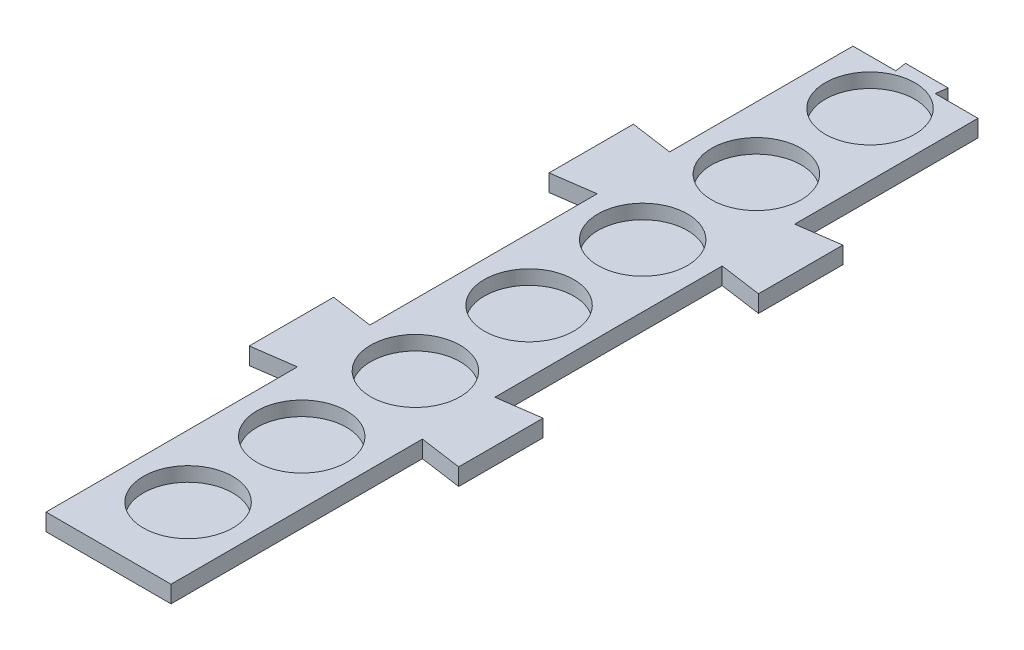
ISO-10303-21;
HEADER;
FILE_DESCRIPTION(('STEP AP214'),'2;1');
FILE_NAME('part.step','',(''),(''),'','','');
FILE_SCHEMA(('AUTOMOTIVE_DESIGN { 1 0 10303 214 1 1 1 1 }'));
ENDSEC;
DATA;
#1=APPLICATION_CONTEXT('core data for automotive mechanical design processes');
#2=APPLICATION_PROTOCOL_DEFINITION('international standard','automotive_design',2000,#1);
#3=PRODUCT_CONTEXT('',#1,'mechanical');
#4=PRODUCT('Part','Part','',(#3));
#5=PRODUCT_RELATED_PRODUCT_CATEGORY('part','',(#4));
#6=PRODUCT_DEFINITION_FORMATION('','',#4);
#7=PRODUCT_DEFINITION_CONTEXT('part definition',#1,'design');
#8=PRODUCT_DEFINITION('design','',#6,#7);
#9=PRODUCT_DEFINITION_SHAPE('','',#8);
#10=(LENGTH_UNIT() NAMED_UNIT(*) SI_UNIT(.MILLI.,.METRE.));
#11=(NAMED_UNIT(*) PLANE_ANGLE_UNIT() SI_UNIT($,.RADIAN.));
#12=(NAMED_UNIT(*) SI_UNIT($,.STERADIAN.) SOLID_ANGLE_UNIT());
#13=UNCERTAINTY_MEASURE_WITH_UNIT(LENGTH_MEASURE(1.E-05),#10,'distance_accuracy_value','');
#14=(GEOMETRIC_REPRESENTATION_CONTEXT(3) GLOBAL_UNCERTAINTY_ASSIGNED_CONTEXT((#13)) GLOBAL_UNIT_ASSIGNED_CONTEXT((#10,
#11,#12)) REPRESENTATION_CONTEXT('',''));
#15=CARTESIAN_POINT('',(0.,0.,0.));
#16=DIRECTION('',(0.,0.,1.));
#17=DIRECTION('',(1.,0.,0.));
#18=AXIS2_PLACEMENT_3D('',#15,#16,#17);
#19=CARTESIAN_POINT('',(0.,0.,15.24));
#20=DIRECTION('',(0.,0.,-1.));
#21=DIRECTION('',(-1.,0.,0.));
#22=AXIS2_PLACEMENT_3D('',#19,#20,#21);
#23=PLANE('',#22);
#24=DIRECTION('',(-1.,0.,0.));
#25=VECTOR('',#24,1.);
#26=CARTESIAN_POINT('',(23.4023033547635,0.,15.24));
#27=LINE('',#26,#25);
#28=CARTESIAN_POINT('',(13.97,0.,15.24));
#29=VERTEX_POINT('',#28);
#30=CARTESIAN_POINT('',(4.40552627985594,0.,15.24));
#31=VERTEX_POINT('',#30);
#32=EDGE_CURVE('E213',#29,#31,#27,.T.);
#33=ORIENTED_EDGE('',*,*,#32,.T.);
#34=DIRECTION('',(0.,1.,0.));
#35=VECTOR('',#34,1.);
#36=CARTESIAN_POINT('',(4.40552627985594,0.,15.24));
#37=LINE('',#36,#35);
#38=CARTESIAN_POINT('',(4.40552627985595,3.81,15.24));
#39=VERTEX_POINT('',#38);
#40=EDGE_CURVE('E201',#31,#39,#37,.T.);
#41=ORIENTED_EDGE('',*,*,#40,.T.);
#42=DIRECTION('',(1.,0.,0.));
#43=VECTOR('',#42,1.);
#44=CARTESIAN_POINT('',(23.4023033547635,3.81,15.24));
#45=LINE('',#44,#43);
#46=CARTESIAN_POINT('',(13.97,3.81,15.24));
#47=VERTEX_POINT('',#46);
#48=EDGE_CURVE('E220',#39,#47,#45,.T.);
#49=ORIENTED_EDGE('',*,*,#48,.T.);
#50=DIRECTION('',(0.,-1.,0.));
#51=VECTOR('',#50,1.);
#52=CARTESIAN_POINT('',(13.97,3.81,15.24));
#53=LINE('',#52,#51);
#54=EDGE_CURVE('E64',#47,#29,#53,.T.);
#55=ORIENTED_EDGE('',*,*,#54,.T.);
#56=EDGE_LOOP('',(#33,#41,#49,#55));
#57=FACE_BOUND('',#56,.T.);
#58=ADVANCED_FACE('F41',(#57),#23,.T.);
#59=CARTESIAN_POINT('',(-13.97,3.81,195.58));
#60=DIRECTION('',(1.,0.,0.));
#61=DIRECTION('',(0.,0.,-1.));
#62=AXIS2_PLACEMENT_3D('',#59,#60,#61);
#63=PLANE('',#62);
#64=DIRECTION('',(0.,1.,0.));
#65=VECTOR('',#64,1.);
#66=CARTESIAN_POINT('',(-13.97,3.81,15.24));
#67=LINE('',#66,#65);
#68=CARTESIAN_POINT('',(-13.9699999999999,0.,15.24));
#69=VERTEX_POINT('',#68);
#70=CARTESIAN_POINT('',(-13.97,3.81,15.24));
#71=VERTEX_POINT('',#70);
#72=EDGE_CURVE('E230',#69,#71,#67,.T.);
#73=ORIENTED_EDGE('',*,*,#72,.F.);
#74=DIRECTION('',(0.,0.,1.));
#75=VECTOR('',#74,1.);
#76=CARTESIAN_POINT('',(-13.97,0.,195.58));
#77=LINE('',#76,#75);
#78=CARTESIAN_POINT('',(-13.97,0.,56.2066572801325));
#79=VERTEX_POINT('',#78);
#80=EDGE_CURVE('E400',#69,#79,#77,.T.);
#81=ORIENTED_EDGE('',*,*,#80,.T.);
#82=DIRECTION('',(0.,-1.,0.));
#83=VECTOR('',#82,1.);
#84=CARTESIAN_POINT('',(-13.9699999999988,3.81,56.2066572801326));
#85=LINE('',#84,#83);
#86=CARTESIAN_POINT('',(-13.97,3.81,56.2066572801325));
#87=VERTEX_POINT('',#86);
#88=EDGE_CURVE('E322',#87,#79,#85,.T.);
#89=ORIENTED_EDGE('',*,*,#88,.F.);
#90=DIRECTION('',(0.,0.,1.));
#91=VECTOR('',#90,1.);
#92=CARTESIAN_POINT('',(-13.97,3.81,195.58));
#93=LINE('',#92,#91);
#94=EDGE_CURVE('E391',#71,#87,#93,.T.);
#95=ORIENTED_EDGE('',*,*,#94,.F.);
#96=EDGE_LOOP('',(#73,#81,#89,#95));
#97=FACE_BOUND('',#96,.T.);
#98=ADVANCED_FACE('F458',(#97),#63,.F.);
#99=CARTESIAN_POINT('',(13.97,3.81,195.58));
#100=DIRECTION('',(-1.,0.,0.));
#101=DIRECTION('',(0.,0.,1.));
#102=AXIS2_PLACEMENT_3D('',#99,#100,#101);
#103=PLANE('',#102);
#104=ORIENTED_EDGE('',*,*,#54,.F.);
#105=DIRECTION('',(0.,0.,-1.));
#106=VECTOR('',#105,1.);
#107=CARTESIAN_POINT('',(13.97,3.81,195.58));
#108=LINE('',#107,#106);
#109=CARTESIAN_POINT('',(13.97,3.81,56.2066572801323));
#110=VERTEX_POINT('',#109);
#111=EDGE_CURVE('E390',#110,#47,#108,.T.);
#112=ORIENTED_EDGE('',*,*,#111,.F.);
#113=DIRECTION('',(0.,-1.,0.));
#114=VECTOR('',#113,1.);
#115=CARTESIAN_POINT('',(13.97,3.81,56.2066572801323));
#116=LINE('',#115,#114);
#117=CARTESIAN_POINT('',(13.97,0.,56.2066572801323));
#118=VERTEX_POINT('',#117);
#119=EDGE_CURVE('E294',#110,#118,#116,.T.);
#120=ORIENTED_EDGE('',*,*,#119,.T.);
#121=DIRECTION('',(0.,0.,-1.));
#122=VECTOR('',#121,1.);
#123=CARTESIAN_POINT('',(13.97,0.,195.58));
#124=LINE('',#123,#122);
#125=EDGE_CURVE('E346',#118,#29,#124,.T.);
#126=ORIENTED_EDGE('',*,*,#125,.T.);
#127=EDGE_LOOP('',(#104,#112,#120,#126));
#128=FACE_BOUND('',#127,.T.);
#129=ADVANCED_FACE('F43',(#128),#103,.F.);
#130=CARTESIAN_POINT('',(0.,3.81,0.));
#131=DIRECTION('',(0.,-1.,0.));
#132=DIRECTION('',(0.,0.,-1.));
#133=AXIS2_PLACEMENT_3D('',#130,#131,#132);
#134=PLANE('',#133);
#135=CARTESIAN_POINT('',(3.70450198294847E-12,3.81,177.8));
#136=DIRECTION('',(0.,1.,0.));
#137=DIRECTION('',(0.,0.,1.));
#138=AXIS2_PLACEMENT_3D('',#135,#136,#137);
#139=CIRCLE('',#138,10.);
#140=CARTESIAN_POINT('',(3.70450198294847E-12,3.81,187.8));
#141=VERTEX_POINT('',#140);
#142=EDGE_CURVE('E380',#141,#141,#139,.T.);
#143=ORIENTED_EDGE('',*,*,#142,.F.);
#144=EDGE_LOOP('',(#143));
#145=FACE_BOUND('',#144,.T.);
#146=CARTESIAN_POINT('',(3.44017349329651E-12,3.81,152.4));
#147=DIRECTION('',(0.,1.,0.));
#148=DIRECTION('',(0.,0.,1.));
#149=AXIS2_PLACEMENT_3D('',#146,#147,#148);
#150=CIRCLE('',#149,10.);
#151=CARTESIAN_POINT('',(3.44017349329651E-12,3.81,162.4));
#152=VERTEX_POINT('',#151);
#153=EDGE_CURVE('E374',#152,#152,#150,.T.);
#154=ORIENTED_EDGE('',*,*,#153,.F.);
#155=EDGE_LOOP('',(#154));
#156=FACE_BOUND('',#155,.T.);
#157=CARTESIAN_POINT('',(3.17562816321004E-12,3.81,127.));
#158=DIRECTION('',(0.,1.,0.));
#159=DIRECTION('',(0.,0.,1.));
#160=AXIS2_PLACEMENT_3D('',#157,#158,#159);
#161=CIRCLE('',#160,10.);
#162=CARTESIAN_POINT('',(3.17562816321004E-12,3.81,137.));
#163=VERTEX_POINT('',#162);
#164=EDGE_CURVE('E368',#163,#163,#161,.T.);
#165=ORIENTED_EDGE('',*,*,#164,.F.);
#166=EDGE_LOOP('',(#165));
#167=FACE_BOUND('',#166,.T.);
#168=CARTESIAN_POINT('',(2.91108283312358E-12,3.81,101.6));
#169=DIRECTION('',(0.,1.,0.));
#170=DIRECTION('',(0.,0.,1.));
#171=AXIS2_PLACEMENT_3D('',#168,#169,#170);
#172=CIRCLE('',#171,10.);
#173=CARTESIAN_POINT('',(2.91108283312358E-12,3.81,111.6));
#174=VERTEX_POINT('',#173);
#175=EDGE_CURVE('E362',#174,#174,#172,.T.);
#176=ORIENTED_EDGE('',*,*,#175,.F.);
#177=EDGE_LOOP('',(#176));
#178=FACE_BOUND('',#177,.T.);
#179=CARTESIAN_POINT('',(2.64675434347161E-12,3.81,76.1999999999997));
#180=DIRECTION('',(0.,1.,0.));
#181=DIRECTION('',(0.,0.,1.));
#182=AXIS2_PLACEMENT_3D('',#179,#180,#181);
#183=CIRCLE('',#182,10.);
#184=CARTESIAN_POINT('',(2.64675434347161E-12,3.81,86.1999999999997));
#185=VERTEX_POINT('',#184);
#186=EDGE_CURVE('E356',#185,#185,#183,.T.);
#187=ORIENTED_EDGE('',*,*,#186,.F.);
#188=EDGE_LOOP('',(#187));
#189=FACE_BOUND('',#188,.T.);
#190=CARTESIAN_POINT('',(2.38220901338515E-12,3.81,50.7999999999998));
#191=DIRECTION('',(0.,1.,0.));
#192=DIRECTION('',(0.,0.,1.));
#193=AXIS2_PLACEMENT_3D('',#190,#191,#192);
#194=CIRCLE('',#193,10.);
#195=CARTESIAN_POINT('',(2.38220901338515E-12,3.81,60.7999999999998));
#196=VERTEX_POINT('',#195);
#197=EDGE_CURVE('E350',#196,#196,#194,.T.);
#198=ORIENTED_EDGE('',*,*,#197,.F.);
#199=EDGE_LOOP('',(#198));
#200=FACE_BOUND('',#199,.T.);
#201=CARTESIAN_POINT('',(2.11766368329869E-12,3.81,25.3999999999998));
#202=DIRECTION('',(0.,1.,0.));
#203=DIRECTION('',(0.,0.,1.));
#204=AXIS2_PLACEMENT_3D('',#201,#202,#203);
#205=CIRCLE('',#204,10.);
#206=CARTESIAN_POINT('',(2.11766368329869E-12,3.81,35.3999999999998));
#207=VERTEX_POINT('',#206);
#208=EDGE_CURVE('E343',#207,#207,#205,.T.);
#209=ORIENTED_EDGE('',*,*,#208,.F.);
#210=EDGE_LOOP('',(#209));
#211=FACE_BOUND('',#210,.T.);
#212=CARTESIAN_POINT('',(-4.40552627985592,3.81,15.24));
#213=VERTEX_POINT('',#212);
#214=EDGE_CURVE('E223',#71,#213,#45,.T.);
#215=ORIENTED_EDGE('',*,*,#214,.F.);
#216=ORIENTED_EDGE('',*,*,#94,.T.);
#217=DIRECTION('',(-0.990268068741573,0.,-0.139173100960046));
#218=VECTOR('',#217,1.);
#219=CARTESIAN_POINT('',(-13.9699999999988,3.81,56.2066572801326));
#220=LINE('',#219,#218);
#221=CARTESIAN_POINT('',(-23.4023033547623,3.81,54.8810334934881));
#222=VERTEX_POINT('',#221);
#223=EDGE_CURVE('E330',#87,#222,#220,.T.);
#224=ORIENTED_EDGE('',*,*,#223,.T.);
#225=DIRECTION('',(0.,0.,1.));
#226=VECTOR('',#225,1.);
#227=CARTESIAN_POINT('',(-23.4023033547623,3.81,54.8810334934881));
#228=LINE('',#227,#226);
#229=CARTESIAN_POINT('',(-23.4023033547619,3.81,73.7278334934881));
#230=VERTEX_POINT('',#229);
#231=EDGE_CURVE('E339',#222,#230,#228,.T.);
#232=ORIENTED_EDGE('',*,*,#231,.T.);
#233=DIRECTION('',(-0.990268068741567,0.,0.139173100960087));
#234=VECTOR('',#233,1.);
#235=CARTESIAN_POINT('',(-13.9699999999985,3.81,72.4022097068433));
#236=LINE('',#235,#234);
#237=CARTESIAN_POINT('',(-13.97,3.81,72.4022097068433));
#238=VERTEX_POINT('',#237);
#239=EDGE_CURVE('E325',#238,#230,#236,.T.);
#240=ORIENTED_EDGE('',*,*,#239,.F.);
#241=CARTESIAN_POINT('',(-13.97,3.81,123.202209706843));
#242=VERTEX_POINT('',#241);
#243=EDGE_CURVE('E394',#238,#242,#93,.T.);
#244=ORIENTED_EDGE('',*,*,#243,.T.);
#245=DIRECTION('',(-0.990268068741573,0.,-0.139173100960046));
#246=VECTOR('',#245,1.);
#247=CARTESIAN_POINT('',(-13.9699999999974,3.81,123.202209706843));
#248=LINE('',#247,#246);
#249=CARTESIAN_POINT('',(-23.4023033547609,3.81,121.876585920199));
#250=VERTEX_POINT('',#249);
#251=EDGE_CURVE('E248',#242,#250,#248,.T.);
#252=ORIENTED_EDGE('',*,*,#251,.T.);
#253=DIRECTION('',(0.,0.,1.));
#254=VECTOR('',#253,1.);
#255=CARTESIAN_POINT('',(-23.4023033547609,3.81,121.876585920199));
#256=LINE('',#255,#254);
#257=CARTESIAN_POINT('',(-23.4023033547605,3.81,140.723385920199));
#258=VERTEX_POINT('',#257);
#259=EDGE_CURVE('E257',#250,#258,#256,.T.);
#260=ORIENTED_EDGE('',*,*,#259,.T.);
#261=DIRECTION('',(-0.990268068741567,0.,0.13917310096009));
#262=VECTOR('',#261,1.);
#263=CARTESIAN_POINT('',(-13.9699999999971,3.81,139.397762133554));
#264=LINE('',#263,#262);
#265=CARTESIAN_POINT('',(-13.97,3.81,139.397762133554));
#266=VERTEX_POINT('',#265);
#267=EDGE_CURVE('E243',#266,#258,#264,.T.);
#268=ORIENTED_EDGE('',*,*,#267,.F.);
#269=CARTESIAN_POINT('',(-13.97,3.81,195.58));
#270=VERTEX_POINT('',#269);
#271=EDGE_CURVE('E388',#266,#270,#93,.T.);
#272=ORIENTED_EDGE('',*,*,#271,.T.);
#273=DIRECTION('',(1.,0.,0.));
#274=VECTOR('',#273,1.);
#275=CARTESIAN_POINT('',(-13.97,3.81,195.58));
#276=LINE('',#275,#274);
#277=CARTESIAN_POINT('',(13.97,3.81,195.58));
#278=VERTEX_POINT('',#277);
#279=EDGE_CURVE('E393',#270,#278,#276,.T.);
#280=ORIENTED_EDGE('',*,*,#279,.T.);
#281=CARTESIAN_POINT('',(13.97,3.81,139.397762133554));
#282=VERTEX_POINT('',#281);
#283=EDGE_CURVE('E385',#278,#282,#108,.T.);
#284=ORIENTED_EDGE('',*,*,#283,.T.);
#285=DIRECTION('',(0.99026806874157,0.,0.139173100960067));
#286=VECTOR('',#285,1.);
#287=CARTESIAN_POINT('',(13.97,3.81,139.397762133554));
#288=LINE('',#287,#286);
#289=CARTESIAN_POINT('',(23.4023033547635,3.81,140.723385920198));
#290=VERTEX_POINT('',#289);
#291=EDGE_CURVE('E275',#282,#290,#288,.T.);
#292=ORIENTED_EDGE('',*,*,#291,.T.);
#293=DIRECTION('',(0.,0.,1.));
#294=VECTOR('',#293,1.);
#295=CARTESIAN_POINT('',(23.4023033547635,3.81,121.876585920198));
#296=LINE('',#295,#294);
#297=CARTESIAN_POINT('',(23.4023033547635,3.81,121.876585920198));
#298=VERTEX_POINT('',#297);
#299=EDGE_CURVE('E284',#298,#290,#296,.T.);
#300=ORIENTED_EDGE('',*,*,#299,.F.);
#301=DIRECTION('',(0.99026806874157,0.,-0.139173100960067));
#302=VECTOR('',#301,1.);
#303=CARTESIAN_POINT('',(13.97,3.81,123.202209706843));
#304=LINE('',#303,#302);
#305=CARTESIAN_POINT('',(13.97,3.81,123.202209706843));
#306=VERTEX_POINT('',#305);
#307=EDGE_CURVE('E270',#306,#298,#304,.T.);
#308=ORIENTED_EDGE('',*,*,#307,.F.);
#309=CARTESIAN_POINT('',(13.97,3.81,72.402209706843));
#310=VERTEX_POINT('',#309);
#311=EDGE_CURVE('E389',#306,#310,#108,.T.);
#312=ORIENTED_EDGE('',*,*,#311,.T.);
#313=DIRECTION('',(0.99026806874157,0.,0.139173100960067));
#314=VECTOR('',#313,1.);
#315=CARTESIAN_POINT('',(13.97,3.81,72.402209706843));
#316=LINE('',#315,#314);
#317=CARTESIAN_POINT('',(23.4023033547635,3.81,73.7278334934876));
#318=VERTEX_POINT('',#317);
#319=EDGE_CURVE('E302',#310,#318,#316,.T.);
#320=ORIENTED_EDGE('',*,*,#319,.T.);
#321=DIRECTION('',(0.,0.,1.));
#322=VECTOR('',#321,1.);
#323=CARTESIAN_POINT('',(23.4023033547635,3.81,54.8810334934876));
#324=LINE('',#323,#322);
#325=CARTESIAN_POINT('',(23.4023033547635,3.81,54.8810334934876));
#326=VERTEX_POINT('',#325);
#327=EDGE_CURVE('E311',#326,#318,#324,.T.);
#328=ORIENTED_EDGE('',*,*,#327,.F.);
#329=DIRECTION('',(0.99026806874157,0.,-0.139173100960067));
#330=VECTOR('',#329,1.);
#331=CARTESIAN_POINT('',(13.97,3.81,56.2066572801323));
#332=LINE('',#331,#330);
#333=EDGE_CURVE('E297',#110,#326,#332,.T.);
#334=ORIENTED_EDGE('',*,*,#333,.F.);
#335=ORIENTED_EDGE('',*,*,#111,.T.);
#336=ORIENTED_EDGE('',*,*,#48,.F.);
#337=DIRECTION('',(0.139173100960059,0.,-0.990268068741571));
#338=VECTOR('',#337,1.);
#339=CARTESIAN_POINT('',(4.7625,3.81,12.7));
#340=LINE('',#339,#338);
#341=CARTESIAN_POINT('',(4.7625,3.81,12.7));
#342=VERTEX_POINT('',#341);
#343=EDGE_CURVE('E56',#39,#342,#340,.T.);
#344=ORIENTED_EDGE('',*,*,#343,.T.);
#345=DIRECTION('',(-1.,0.,0.));
#346=VECTOR('',#345,1.);
#347=CARTESIAN_POINT('',(-4.7625,3.81,12.7));
#348=LINE('',#347,#346);
#349=CARTESIAN_POINT('',(-4.7625,3.81,12.7));
#350=VERTEX_POINT('',#349);
#351=EDGE_CURVE('E474',#342,#350,#348,.T.);
#352=ORIENTED_EDGE('',*,*,#351,.T.);
#353=DIRECTION('',(0.139173100960067,0.,0.99026806874157));
#354=VECTOR('',#353,1.);
#355=CARTESIAN_POINT('',(-4.40552627985592,3.81,15.24));
#356=LINE('',#355,#354);
#357=EDGE_CURVE('E218',#350,#213,#356,.T.);
#358=ORIENTED_EDGE('',*,*,#357,.T.);
#359=EDGE_LOOP('',(#215,#216,#224,#232,#240,#244,#252,#260,#268,#272,#280,#284,#292,#300,#308,
#312,#320,#328,#334,#335,#336,#344,#352,#358));
#360=FACE_BOUND('',#359,.T.);
#361=ADVANCED_FACE('F421',(#145,#156,#167,#178,#189,#200,#211,#360),#134,.F.);
#362=CARTESIAN_POINT('',(0.,0.,0.));
#363=DIRECTION('',(0.,-1.,0.));
#364=DIRECTION('',(0.,0.,-1.));
#365=AXIS2_PLACEMENT_3D('',#362,#363,#364);
#366=PLANE('',#365);
#367=ORIENTED_EDGE('',*,*,#80,.F.);
#368=CARTESIAN_POINT('',(-4.40552627985592,0.,15.24));
#369=VERTEX_POINT('',#368);
#370=EDGE_CURVE('E221',#369,#69,#27,.T.);
#371=ORIENTED_EDGE('',*,*,#370,.F.);
#372=DIRECTION('',(0.139173100960067,0.,0.99026806874157));
#373=VECTOR('',#372,1.);
#374=CARTESIAN_POINT('',(-4.40552627985592,0.,15.24));
#375=LINE('',#374,#373);
#376=CARTESIAN_POINT('',(-4.7625,0.,12.7));
#377=VERTEX_POINT('',#376);
#378=EDGE_CURVE('E207',#377,#369,#375,.T.);
#379=ORIENTED_EDGE('',*,*,#378,.F.);
#380=DIRECTION('',(-1.,0.,0.));
#381=VECTOR('',#380,1.);
#382=CARTESIAN_POINT('',(-4.7625,0.,12.7));
#383=LINE('',#382,#381);
#384=CARTESIAN_POINT('',(4.7625,0.,12.7));
#385=VERTEX_POINT('',#384);
#386=EDGE_CURVE('E217',#385,#377,#383,.T.);
#387=ORIENTED_EDGE('',*,*,#386,.F.);
#388=DIRECTION('',(0.139173100960059,0.,-0.990268068741571));
#389=VECTOR('',#388,1.);
#390=CARTESIAN_POINT('',(4.7625,0.,12.7));
#391=LINE('',#390,#389);
#392=EDGE_CURVE('E204',#31,#385,#391,.T.);
#393=ORIENTED_EDGE('',*,*,#392,.F.);
#394=ORIENTED_EDGE('',*,*,#32,.F.);
#395=ORIENTED_EDGE('',*,*,#125,.F.);
#396=DIRECTION('',(0.99026806874157,0.,-0.139173100960067));
#397=VECTOR('',#396,1.);
#398=CARTESIAN_POINT('',(13.97,0.,56.2066572801323));
#399=LINE('',#398,#397);
#400=CARTESIAN_POINT('',(23.4023033547635,0.,54.8810334934876));
#401=VERTEX_POINT('',#400);
#402=EDGE_CURVE('E298',#118,#401,#399,.T.);
#403=ORIENTED_EDGE('',*,*,#402,.T.);
#404=DIRECTION('',(0.,0.,1.));
#405=VECTOR('',#404,1.);
#406=CARTESIAN_POINT('',(23.4023033547635,0.,54.8810334934876));
#407=LINE('',#406,#405);
#408=CARTESIAN_POINT('',(23.4023033547635,0.,73.7278334934876));
#409=VERTEX_POINT('',#408);
#410=EDGE_CURVE('E301',#401,#409,#407,.T.);
#411=ORIENTED_EDGE('',*,*,#410,.T.);
#412=DIRECTION('',(0.99026806874157,0.,0.139173100960067));
#413=VECTOR('',#412,1.);
#414=CARTESIAN_POINT('',(13.97,0.,72.402209706843));
#415=LINE('',#414,#413);
#416=CARTESIAN_POINT('',(13.97,0.,72.402209706843));
#417=VERTEX_POINT('',#416);
#418=EDGE_CURVE('E305',#417,#409,#415,.T.);
#419=ORIENTED_EDGE('',*,*,#418,.F.);
#420=CARTESIAN_POINT('',(13.97,0.,123.202209706843));
#421=VERTEX_POINT('',#420);
#422=EDGE_CURVE('E399',#421,#417,#124,.T.);
#423=ORIENTED_EDGE('',*,*,#422,.F.);
#424=DIRECTION('',(0.99026806874157,0.,-0.139173100960067));
#425=VECTOR('',#424,1.);
#426=CARTESIAN_POINT('',(13.97,0.,123.202209706843));
#427=LINE('',#426,#425);
#428=CARTESIAN_POINT('',(23.4023033547635,0.,121.876585920198));
#429=VERTEX_POINT('',#428);
#430=EDGE_CURVE('E271',#421,#429,#427,.T.);
#431=ORIENTED_EDGE('',*,*,#430,.T.);
#432=DIRECTION('',(0.,0.,1.));
#433=VECTOR('',#432,1.);
#434=CARTESIAN_POINT('',(23.4023033547635,0.,121.876585920198));
#435=LINE('',#434,#433);
#436=CARTESIAN_POINT('',(23.4023033547635,0.,140.723385920198));
#437=VERTEX_POINT('',#436);
#438=EDGE_CURVE('E274',#429,#437,#435,.T.);
#439=ORIENTED_EDGE('',*,*,#438,.T.);
#440=DIRECTION('',(0.99026806874157,0.,0.139173100960067));
#441=VECTOR('',#440,1.);
#442=CARTESIAN_POINT('',(13.97,0.,139.397762133554));
#443=LINE('',#442,#441);
#444=CARTESIAN_POINT('',(13.97,0.,139.397762133554));
#445=VERTEX_POINT('',#444);
#446=EDGE_CURVE('E278',#445,#437,#443,.T.);
#447=ORIENTED_EDGE('',*,*,#446,.F.);
#448=CARTESIAN_POINT('',(13.97,0.,195.58));
#449=VERTEX_POINT('',#448);
#450=EDGE_CURVE('E396',#449,#445,#124,.T.);
#451=ORIENTED_EDGE('',*,*,#450,.F.);
#452=DIRECTION('',(1.,0.,0.));
#453=VECTOR('',#452,1.);
#454=CARTESIAN_POINT('',(-13.97,0.,195.58));
#455=LINE('',#454,#453);
#456=CARTESIAN_POINT('',(-13.97,0.,195.58));
#457=VERTEX_POINT('',#456);
#458=EDGE_CURVE('E402',#457,#449,#455,.T.);
#459=ORIENTED_EDGE('',*,*,#458,.F.);
#460=CARTESIAN_POINT('',(-13.9699999999971,0.,139.397762133554));
#461=VERTEX_POINT('',#460);
#462=EDGE_CURVE('E398',#461,#457,#77,.T.);
#463=ORIENTED_EDGE('',*,*,#462,.F.);
#464=DIRECTION('',(-0.990268068741567,0.,0.13917310096009));
#465=VECTOR('',#464,1.);
#466=CARTESIAN_POINT('',(-13.9699999999971,0.,139.397762133554));
#467=LINE('',#466,#465);
#468=CARTESIAN_POINT('',(-23.4023033547605,0.,140.723385920199));
#469=VERTEX_POINT('',#468);
#470=EDGE_CURVE('E244',#461,#469,#467,.T.);
#471=ORIENTED_EDGE('',*,*,#470,.T.);
#472=DIRECTION('',(0.,0.,1.));
#473=VECTOR('',#472,1.);
#474=CARTESIAN_POINT('',(-23.4023033547609,0.,121.876585920199));
#475=LINE('',#474,#473);
#476=CARTESIAN_POINT('',(-23.4023033547609,0.,121.876585920199));
#477=VERTEX_POINT('',#476);
#478=EDGE_CURVE('E247',#477,#469,#475,.T.);
#479=ORIENTED_EDGE('',*,*,#478,.F.);
#480=DIRECTION('',(-0.990268068741573,0.,-0.139173100960046));
#481=VECTOR('',#480,1.);
#482=CARTESIAN_POINT('',(-13.9699999999974,0.,123.202209706843));
#483=LINE('',#482,#481);
#484=CARTESIAN_POINT('',(-13.97,0.,123.202209706843));
#485=VERTEX_POINT('',#484);
#486=EDGE_CURVE('E251',#485,#477,#483,.T.);
#487=ORIENTED_EDGE('',*,*,#486,.F.);
#488=CARTESIAN_POINT('',(-13.9699999999985,0.,72.4022097068433));
#489=VERTEX_POINT('',#488);
#490=EDGE_CURVE('E403',#489,#485,#77,.T.);
#491=ORIENTED_EDGE('',*,*,#490,.F.);
#492=DIRECTION('',(-0.990268068741567,0.,0.139173100960087));
#493=VECTOR('',#492,1.);
#494=CARTESIAN_POINT('',(-13.9699999999985,0.,72.4022097068433));
#495=LINE('',#494,#493);
#496=CARTESIAN_POINT('',(-23.4023033547619,0.,73.7278334934881));
#497=VERTEX_POINT('',#496);
#498=EDGE_CURVE('E326',#489,#497,#495,.T.);
#499=ORIENTED_EDGE('',*,*,#498,.T.);
#500=DIRECTION('',(0.,0.,1.));
#501=VECTOR('',#500,1.);
#502=CARTESIAN_POINT('',(-23.4023033547623,0.,54.8810334934881));
#503=LINE('',#502,#501);
#504=CARTESIAN_POINT('',(-23.4023033547623,0.,54.8810334934881));
#505=VERTEX_POINT('',#504);
#506=EDGE_CURVE('E329',#505,#497,#503,.T.);
#507=ORIENTED_EDGE('',*,*,#506,.F.);
#508=DIRECTION('',(-0.990268068741573,0.,-0.139173100960046));
#509=VECTOR('',#508,1.);
#510=CARTESIAN_POINT('',(-13.9699999999988,0.,56.2066572801326));
#511=LINE('',#510,#509);
#512=EDGE_CURVE('E333',#79,#505,#511,.T.);
#513=ORIENTED_EDGE('',*,*,#512,.F.);
#514=EDGE_LOOP('',(#367,#371,#379,#387,#393,#394,#395,#403,#411,#419,#423,#431,#439,#447,#451,
#459,#463,#471,#479,#487,#491,#499,#507,#513));
#515=FACE_BOUND('',#514,.T.);
#516=ADVANCED_FACE('F212',(#515),#366,.T.);
#517=DIRECTION('',(0.,-1.,0.));
#518=VECTOR('',#517,1.);
#519=CARTESIAN_POINT('',(-13.9699999999974,3.81,123.202209706843));
#520=LINE('',#519,#518);
#521=EDGE_CURVE('E240',#242,#485,#520,.T.);
#522=ORIENTED_EDGE('',*,*,#521,.F.);
#523=ORIENTED_EDGE('',*,*,#243,.F.);
#524=DIRECTION('',(0.,-1.,0.));
#525=VECTOR('',#524,1.);
#526=CARTESIAN_POINT('',(-13.9699999999985,3.81,72.4022097068433));
#527=LINE('',#526,#525);
#528=EDGE_CURVE('E319',#238,#489,#527,.T.);
#529=ORIENTED_EDGE('',*,*,#528,.T.);
#530=ORIENTED_EDGE('',*,*,#490,.T.);
#531=EDGE_LOOP('',(#522,#523,#529,#530));
#532=FACE_BOUND('',#531,.T.);
#533=ADVANCED_FACE('F431',(#532),#63,.F.);
#534=DIRECTION('',(0.,-1.,0.));
#535=VECTOR('',#534,1.);
#536=CARTESIAN_POINT('',(13.97,3.81,139.397762133554));
#537=LINE('',#536,#535);
#538=EDGE_CURVE('E254',#282,#445,#537,.T.);
#539=ORIENTED_EDGE('',*,*,#538,.F.);
#540=ORIENTED_EDGE('',*,*,#283,.F.);
#541=DIRECTION('',(0.,-1.,0.));
#542=VECTOR('',#541,1.);
#543=CARTESIAN_POINT('',(13.97,3.81,195.58));
#544=LINE('',#543,#542);
#545=EDGE_CURVE('E49',#278,#449,#544,.T.);
#546=ORIENTED_EDGE('',*,*,#545,.T.);
#547=ORIENTED_EDGE('',*,*,#450,.T.);
#548=EDGE_LOOP('',(#539,#540,#546,#547));
#549=FACE_BOUND('',#548,.T.);
#550=ADVANCED_FACE('F409',(#549),#103,.F.);
#551=ORIENTED_EDGE('',*,*,#311,.F.);
#552=DIRECTION('',(0.,-1.,0.));
#553=VECTOR('',#552,1.);
#554=CARTESIAN_POINT('',(13.97,3.81,123.202209706843));
#555=LINE('',#554,#553);
#556=EDGE_CURVE('E267',#306,#421,#555,.T.);
#557=ORIENTED_EDGE('',*,*,#556,.T.);
#558=ORIENTED_EDGE('',*,*,#422,.T.);
#559=DIRECTION('',(0.,-1.,0.));
#560=VECTOR('',#559,1.);
#561=CARTESIAN_POINT('',(13.97,3.81,72.402209706843));
#562=LINE('',#561,#560);
#563=EDGE_CURVE('E281',#310,#417,#562,.T.);
#564=ORIENTED_EDGE('',*,*,#563,.F.);
#565=EDGE_LOOP('',(#551,#557,#558,#564));
#566=FACE_BOUND('',#565,.T.);
#567=ADVANCED_FACE('F594',(#566),#103,.F.);
#568=ORIENTED_EDGE('',*,*,#271,.F.);
#569=DIRECTION('',(0.,-1.,0.));
#570=VECTOR('',#569,1.);
#571=CARTESIAN_POINT('',(-13.9699999999971,3.81,139.397762133554));
#572=LINE('',#571,#570);
#573=EDGE_CURVE('E237',#266,#461,#572,.T.);
#574=ORIENTED_EDGE('',*,*,#573,.T.);
#575=ORIENTED_EDGE('',*,*,#462,.T.);
#576=DIRECTION('',(0.,-1.,0.));
#577=VECTOR('',#576,1.);
#578=CARTESIAN_POINT('',(-13.97,3.81,195.58));
#579=LINE('',#578,#577);
#580=EDGE_CURVE('E11',#270,#457,#579,.T.);
#581=ORIENTED_EDGE('',*,*,#580,.F.);
#582=EDGE_LOOP('',(#568,#574,#575,#581));
#583=FACE_BOUND('',#582,.T.);
#584=ADVANCED_FACE('F427',(#583),#63,.F.);
#585=CARTESIAN_POINT('',(-13.97,3.81,195.58));
#586=DIRECTION('',(0.,0.,-1.));
#587=DIRECTION('',(-1.,0.,0.));
#588=AXIS2_PLACEMENT_3D('',#585,#586,#587);
#589=PLANE('',#588);
#590=ORIENTED_EDGE('',*,*,#458,.T.);
#591=ORIENTED_EDGE('',*,*,#545,.F.);
#592=ORIENTED_EDGE('',*,*,#279,.F.);
#593=ORIENTED_EDGE('',*,*,#580,.T.);
#594=EDGE_LOOP('',(#590,#591,#592,#593));
#595=FACE_BOUND('',#594,.T.);
#596=ADVANCED_FACE('F425',(#595),#589,.F.);
#597=CARTESIAN_POINT('',(3.70450198294847E-12,0.6,177.8));
#598=DIRECTION('',(0.,1.,0.));
#599=DIRECTION('',(0.,0.,1.));
#600=AXIS2_PLACEMENT_3D('',#597,#598,#599);
#601=CYLINDRICAL_SURFACE('',#600,10.);
#602=CARTESIAN_POINT('',(3.70450198294847E-12,0.6,177.8));
#603=DIRECTION('',(0.,1.,0.));
#604=DIRECTION('',(0.,0.,1.));
#605=AXIS2_PLACEMENT_3D('',#602,#603,#604);
#606=CIRCLE('',#605,10.);
#607=CARTESIAN_POINT('',(3.70450198294847E-12,0.6,187.8));
#608=VERTEX_POINT('',#607);
#609=EDGE_CURVE('E336',#608,#608,#606,.T.);
#610=ORIENTED_EDGE('',*,*,#609,.F.);
#611=EDGE_LOOP('',(#610));
#612=FACE_BOUND('',#611,.T.);
#613=ORIENTED_EDGE('',*,*,#142,.T.);
#614=EDGE_LOOP('',(#613));
#615=FACE_BOUND('',#614,.T.);
#616=ADVANCED_FACE('F580',(#612,#615),#601,.F.);
#617=CARTESIAN_POINT('',(3.70450198294847E-12,0.6,177.8));
#618=DIRECTION('',(0.,1.,0.));
#619=DIRECTION('',(0.,0.,1.));
#620=AXIS2_PLACEMENT_3D('',#617,#618,#619);
#621=PLANE('',#620);
#622=ORIENTED_EDGE('',*,*,#609,.T.);
#623=EDGE_LOOP('',(#622));
#624=FACE_BOUND('',#623,.T.);
#625=ADVANCED_FACE('F575',(#624),#621,.T.);
#626=CARTESIAN_POINT('',(3.44017349329651E-12,0.6,152.4));
#627=DIRECTION('',(0.,1.,0.));
#628=DIRECTION('',(0.,0.,1.));
#629=AXIS2_PLACEMENT_3D('',#626,#627,#628);
#630=CYLINDRICAL_SURFACE('',#629,10.);
#631=CARTESIAN_POINT('',(3.44017349329651E-12,0.6,152.4));
#632=DIRECTION('',(0.,1.,0.));
#633=DIRECTION('',(0.,0.,1.));
#634=AXIS2_PLACEMENT_3D('',#631,#632,#633);
#635=CIRCLE('',#634,10.);
#636=CARTESIAN_POINT('',(3.44017349329651E-12,0.6,162.4));
#637=VERTEX_POINT('',#636);
#638=EDGE_CURVE('E377',#637,#637,#635,.T.);
#639=ORIENTED_EDGE('',*,*,#638,.F.);
#640=EDGE_LOOP('',(#639));
#641=FACE_BOUND('',#640,.T.);
#642=ORIENTED_EDGE('',*,*,#153,.T.);
#643=EDGE_LOOP('',(#642));
#644=FACE_BOUND('',#643,.T.);
#645=ADVANCED_FACE('F572',(#641,#644),#630,.F.);
#646=CARTESIAN_POINT('',(3.44017349329651E-12,0.6,152.4));
#647=DIRECTION('',(0.,1.,0.));
#648=DIRECTION('',(0.,0.,1.));
#649=AXIS2_PLACEMENT_3D('',#646,#647,#648);
#650=PLANE('',#649);
#651=ORIENTED_EDGE('',*,*,#638,.T.);
#652=EDGE_LOOP('',(#651));
#653=FACE_BOUND('',#652,.T.);
#654=ADVANCED_FACE('F567',(#653),#650,.T.);
#655=CARTESIAN_POINT('',(3.17562816321004E-12,0.6,127.));
#656=DIRECTION('',(0.,1.,0.));
#657=DIRECTION('',(0.,0.,1.));
#658=AXIS2_PLACEMENT_3D('',#655,#656,#657);
#659=CYLINDRICAL_SURFACE('',#658,10.);
#660=CARTESIAN_POINT('',(3.17562816321004E-12,0.6,127.));
#661=DIRECTION('',(0.,1.,0.));
#662=DIRECTION('',(0.,0.,1.));
#663=AXIS2_PLACEMENT_3D('',#660,#661,#662);
#664=CIRCLE('',#663,10.);
#665=CARTESIAN_POINT('',(3.17562816321004E-12,0.6,137.));
#666=VERTEX_POINT('',#665);
#667=EDGE_CURVE('E371',#666,#666,#664,.T.);
#668=ORIENTED_EDGE('',*,*,#667,.F.);
#669=EDGE_LOOP('',(#668));
#670=FACE_BOUND('',#669,.T.);
#671=ORIENTED_EDGE('',*,*,#164,.T.);
#672=EDGE_LOOP('',(#671));
#673=FACE_BOUND('',#672,.T.);
#674=ADVANCED_FACE('F564',(#670,#673),#659,.F.);
#675=CARTESIAN_POINT('',(3.17562816321004E-12,0.6,127.));
#676=DIRECTION('',(0.,1.,0.));
#677=DIRECTION('',(0.,0.,1.));
#678=AXIS2_PLACEMENT_3D('',#675,#676,#677);
#679=PLANE('',#678);
#680=ORIENTED_EDGE('',*,*,#667,.T.);
#681=EDGE_LOOP('',(#680));
#682=FACE_BOUND('',#681,.T.);
#683=ADVANCED_FACE('F559',(#682),#679,.T.);
#684=CARTESIAN_POINT('',(2.91108283312358E-12,0.6,101.6));
#685=DIRECTION('',(0.,1.,0.));
#686=DIRECTION('',(0.,0.,1.));
#687=AXIS2_PLACEMENT_3D('',#684,#685,#686);
#688=CYLINDRICAL_SURFACE('',#687,10.);
#689=CARTESIAN_POINT('',(2.91108283312358E-12,0.6,101.6));
#690=DIRECTION('',(0.,1.,0.));
#691=DIRECTION('',(0.,0.,1.));
#692=AXIS2_PLACEMENT_3D('',#689,#690,#691);
#693=CIRCLE('',#692,10.);
#694=CARTESIAN_POINT('',(2.91108283312358E-12,0.6,111.6));
#695=VERTEX_POINT('',#694);
#696=EDGE_CURVE('E365',#695,#695,#693,.T.);
#697=ORIENTED_EDGE('',*,*,#696,.F.);
#698=EDGE_LOOP('',(#697));
#699=FACE_BOUND('',#698,.T.);
#700=ORIENTED_EDGE('',*,*,#175,.T.);
#701=EDGE_LOOP('',(#700));
#702=FACE_BOUND('',#701,.T.);
#703=ADVANCED_FACE('F556',(#699,#702),#688,.F.);
#704=CARTESIAN_POINT('',(2.91108283312358E-12,0.6,101.6));
#705=DIRECTION('',(0.,1.,0.));
#706=DIRECTION('',(0.,0.,1.));
#707=AXIS2_PLACEMENT_3D('',#704,#705,#706);
#708=PLANE('',#707);
#709=ORIENTED_EDGE('',*,*,#696,.T.);
#710=EDGE_LOOP('',(#709));
#711=FACE_BOUND('',#710,.T.);
#712=ADVANCED_FACE('F551',(#711),#708,.T.);
#713=CARTESIAN_POINT('',(2.64675434347161E-12,0.6,76.1999999999997));
#714=DIRECTION('',(0.,1.,0.));
#715=DIRECTION('',(0.,0.,1.));
#716=AXIS2_PLACEMENT_3D('',#713,#714,#715);
#717=CYLINDRICAL_SURFACE('',#716,10.);
#718=CARTESIAN_POINT('',(2.64675434347161E-12,0.6,76.1999999999997));
#719=DIRECTION('',(0.,1.,0.));
#720=DIRECTION('',(0.,0.,1.));
#721=AXIS2_PLACEMENT_3D('',#718,#719,#720);
#722=CIRCLE('',#721,10.);
#723=CARTESIAN_POINT('',(2.64675434347161E-12,0.6,86.1999999999997));
#724=VERTEX_POINT('',#723);
#725=EDGE_CURVE('E359',#724,#724,#722,.T.);
#726=ORIENTED_EDGE('',*,*,#725,.F.);
#727=EDGE_LOOP('',(#726));
#728=FACE_BOUND('',#727,.T.);
#729=ORIENTED_EDGE('',*,*,#186,.T.);
#730=EDGE_LOOP('',(#729));
#731=FACE_BOUND('',#730,.T.);
#732=ADVANCED_FACE('F548',(#728,#731),#717,.F.);
#733=CARTESIAN_POINT('',(2.64675434347161E-12,0.6,76.1999999999997));
#734=DIRECTION('',(0.,1.,0.));
#735=DIRECTION('',(0.,0.,1.));
#736=AXIS2_PLACEMENT_3D('',#733,#734,#735);
#737=PLANE('',#736);
#738=ORIENTED_EDGE('',*,*,#725,.T.);
#739=EDGE_LOOP('',(#738));
#740=FACE_BOUND('',#739,.T.);
#741=ADVANCED_FACE('F543',(#740),#737,.T.);
#742=CARTESIAN_POINT('',(2.38220901338515E-12,0.6,50.7999999999998));
#743=DIRECTION('',(0.,1.,0.));
#744=DIRECTION('',(0.,0.,1.));
#745=AXIS2_PLACEMENT_3D('',#742,#743,#744);
#746=CYLINDRICAL_SURFACE('',#745,10.);
#747=CARTESIAN_POINT('',(2.38220901338515E-12,0.6,50.7999999999998));
#748=DIRECTION('',(0.,1.,0.));
#749=DIRECTION('',(0.,0.,1.));
#750=AXIS2_PLACEMENT_3D('',#747,#748,#749);
#751=CIRCLE('',#750,10.);
#752=CARTESIAN_POINT('',(2.38220901338515E-12,0.6,60.7999999999998));
#753=VERTEX_POINT('',#752);
#754=EDGE_CURVE('E353',#753,#753,#751,.T.);
#755=ORIENTED_EDGE('',*,*,#754,.F.);
#756=EDGE_LOOP('',(#755));
#757=FACE_BOUND('',#756,.T.);
#758=ORIENTED_EDGE('',*,*,#197,.T.);
#759=EDGE_LOOP('',(#758));
#760=FACE_BOUND('',#759,.T.);
#761=ADVANCED_FACE('F540',(#757,#760),#746,.F.);
#762=CARTESIAN_POINT('',(2.38220901338515E-12,0.6,50.7999999999998));
#763=DIRECTION('',(0.,1.,0.));
#764=DIRECTION('',(0.,0.,1.));
#765=AXIS2_PLACEMENT_3D('',#762,#763,#764);
#766=PLANE('',#765);
#767=ORIENTED_EDGE('',*,*,#754,.T.);
#768=EDGE_LOOP('',(#767));
#769=FACE_BOUND('',#768,.T.);
#770=ADVANCED_FACE('F535',(#769),#766,.T.);
#771=CARTESIAN_POINT('',(2.11766368329869E-12,0.6,25.3999999999998));
#772=DIRECTION('',(0.,1.,0.));
#773=DIRECTION('',(0.,0.,1.));
#774=AXIS2_PLACEMENT_3D('',#771,#772,#773);
#775=CYLINDRICAL_SURFACE('',#774,10.);
#776=CARTESIAN_POINT('',(2.11766368329869E-12,0.6,25.3999999999998));
#777=DIRECTION('',(0.,1.,0.));
#778=DIRECTION('',(0.,0.,1.));
#779=AXIS2_PLACEMENT_3D('',#776,#777,#778);
#780=CIRCLE('',#779,10.);
#781=CARTESIAN_POINT('',(2.11766368329869E-12,0.6,35.3999999999998));
#782=VERTEX_POINT('',#781);
#783=EDGE_CURVE('E347',#782,#782,#780,.T.);
#784=ORIENTED_EDGE('',*,*,#783,.F.);
#785=EDGE_LOOP('',(#784));
#786=FACE_BOUND('',#785,.T.);
#787=ORIENTED_EDGE('',*,*,#208,.T.);
#788=EDGE_LOOP('',(#787));
#789=FACE_BOUND('',#788,.T.);
#790=ADVANCED_FACE('F532',(#786,#789),#775,.F.);
#791=CARTESIAN_POINT('',(2.11766368329869E-12,0.6,25.3999999999998));
#792=DIRECTION('',(0.,1.,0.));
#793=DIRECTION('',(0.,0.,1.));
#794=AXIS2_PLACEMENT_3D('',#791,#792,#793);
#795=PLANE('',#794);
#796=ORIENTED_EDGE('',*,*,#783,.T.);
#797=EDGE_LOOP('',(#796));
#798=FACE_BOUND('',#797,.T.);
#799=ADVANCED_FACE('F527',(#798),#795,.T.);
#800=CARTESIAN_POINT('',(-13.9699999999988,3.81,56.2066572801326));
#801=DIRECTION('',(-0.139173100960046,0.,0.990268068741573));
#802=DIRECTION('',(0.990268068741573,0.,0.139173100960046));
#803=AXIS2_PLACEMENT_3D('',#800,#801,#802);
#804=PLANE('',#803);
#805=ORIENTED_EDGE('',*,*,#512,.T.);
#806=DIRECTION('',(0.,-1.,0.));
#807=VECTOR('',#806,1.);
#808=CARTESIAN_POINT('',(-23.4023033547623,3.81,54.8810334934881));
#809=LINE('',#808,#807);
#810=EDGE_CURVE('E308',#222,#505,#809,.T.);
#811=ORIENTED_EDGE('',*,*,#810,.F.);
#812=ORIENTED_EDGE('',*,*,#223,.F.);
#813=ORIENTED_EDGE('',*,*,#88,.T.);
#814=EDGE_LOOP('',(#805,#811,#812,#813));
#815=FACE_BOUND('',#814,.T.);
#816=ADVANCED_FACE('F453',(#815),#804,.F.);
#817=CARTESIAN_POINT('',(-23.4023033547623,3.81,54.8810334934881));
#818=DIRECTION('',(1.,0.,0.));
#819=DIRECTION('',(0.,0.,-1.));
#820=AXIS2_PLACEMENT_3D('',#817,#818,#819);
#821=PLANE('',#820);
#822=ORIENTED_EDGE('',*,*,#506,.T.);
#823=DIRECTION('',(0.,-1.,0.));
#824=VECTOR('',#823,1.);
#825=CARTESIAN_POINT('',(-23.4023033547619,3.81,73.7278334934881));
#826=LINE('',#825,#824);
#827=EDGE_CURVE('E317',#230,#497,#826,.T.);
#828=ORIENTED_EDGE('',*,*,#827,.F.);
#829=ORIENTED_EDGE('',*,*,#231,.F.);
#830=ORIENTED_EDGE('',*,*,#810,.T.);
#831=EDGE_LOOP('',(#822,#828,#829,#830));
#832=FACE_BOUND('',#831,.T.);
#833=ADVANCED_FACE('F450',(#832),#821,.F.);
#834=CARTESIAN_POINT('',(-13.9699999999985,3.81,72.4022097068433));
#835=DIRECTION('',(0.139173100960087,0.,0.990268068741567));
#836=DIRECTION('',(0.990268068741567,0.,-0.139173100960087));
#837=AXIS2_PLACEMENT_3D('',#834,#835,#836);
#838=PLANE('',#837);
#839=ORIENTED_EDGE('',*,*,#498,.F.);
#840=ORIENTED_EDGE('',*,*,#528,.F.);
#841=ORIENTED_EDGE('',*,*,#239,.T.);
#842=ORIENTED_EDGE('',*,*,#827,.T.);
#843=EDGE_LOOP('',(#839,#840,#841,#842));
#844=FACE_BOUND('',#843,.T.);
#845=ADVANCED_FACE('F445',(#844),#838,.T.);
#846=CARTESIAN_POINT('',(13.97,3.81,72.402209706843));
#847=DIRECTION('',(0.139173100960067,0.,-0.99026806874157));
#848=DIRECTION('',(-0.99026806874157,0.,-0.139173100960067));
#849=AXIS2_PLACEMENT_3D('',#846,#847,#848);
#850=PLANE('',#849);
#851=ORIENTED_EDGE('',*,*,#418,.T.);
#852=DIRECTION('',(0.,-1.,0.));
#853=VECTOR('',#852,1.);
#854=CARTESIAN_POINT('',(23.4023033547635,3.81,73.7278334934876));
#855=LINE('',#854,#853);
#856=EDGE_CURVE('E290',#318,#409,#855,.T.);
#857=ORIENTED_EDGE('',*,*,#856,.F.);
#858=ORIENTED_EDGE('',*,*,#319,.F.);
#859=ORIENTED_EDGE('',*,*,#563,.T.);
#860=EDGE_LOOP('',(#851,#857,#858,#859));
#861=FACE_BOUND('',#860,.T.);
#862=ADVANCED_FACE('F514',(#861),#850,.F.);
#863=CARTESIAN_POINT('',(23.4023033547635,3.81,54.8810334934876));
#864=DIRECTION('',(1.,0.,0.));
#865=DIRECTION('',(0.,0.,-1.));
#866=AXIS2_PLACEMENT_3D('',#863,#864,#865);
#867=PLANE('',#866);
#868=ORIENTED_EDGE('',*,*,#410,.F.);
#869=DIRECTION('',(0.,-1.,0.));
#870=VECTOR('',#869,1.);
#871=CARTESIAN_POINT('',(23.4023033547635,3.81,54.8810334934876));
#872=LINE('',#871,#870);
#873=EDGE_CURVE('E292',#326,#401,#872,.T.);
#874=ORIENTED_EDGE('',*,*,#873,.F.);
#875=ORIENTED_EDGE('',*,*,#327,.T.);
#876=ORIENTED_EDGE('',*,*,#856,.T.);
#877=EDGE_LOOP('',(#868,#874,#875,#876));
#878=FACE_BOUND('',#877,.T.);
#879=ADVANCED_FACE('F517',(#878),#867,.T.);
#880=CARTESIAN_POINT('',(13.97,3.81,56.2066572801323));
#881=DIRECTION('',(-0.139173100960067,0.,-0.99026806874157));
#882=DIRECTION('',(-0.99026806874157,0.,0.139173100960067));
#883=AXIS2_PLACEMENT_3D('',#880,#881,#882);
#884=PLANE('',#883);
#885=ORIENTED_EDGE('',*,*,#402,.F.);
#886=ORIENTED_EDGE('',*,*,#119,.F.);
#887=ORIENTED_EDGE('',*,*,#333,.T.);
#888=ORIENTED_EDGE('',*,*,#873,.T.);
#889=EDGE_LOOP('',(#885,#886,#887,#888));
#890=FACE_BOUND('',#889,.T.);
#891=ADVANCED_FACE('F507',(#890),#884,.T.);
#892=CARTESIAN_POINT('',(13.97,3.81,139.397762133554));
#893=DIRECTION('',(0.139173100960067,0.,-0.99026806874157));
#894=DIRECTION('',(-0.99026806874157,0.,-0.139173100960067));
#895=AXIS2_PLACEMENT_3D('',#892,#893,#894);
#896=PLANE('',#895);
#897=ORIENTED_EDGE('',*,*,#446,.T.);
#898=DIRECTION('',(0.,-1.,0.));
#899=VECTOR('',#898,1.);
#900=CARTESIAN_POINT('',(23.4023033547635,3.81,140.723385920198));
#901=LINE('',#900,#899);
#902=EDGE_CURVE('E263',#290,#437,#901,.T.);
#903=ORIENTED_EDGE('',*,*,#902,.F.);
#904=ORIENTED_EDGE('',*,*,#291,.F.);
#905=ORIENTED_EDGE('',*,*,#538,.T.);
#906=EDGE_LOOP('',(#897,#903,#904,#905));
#907=FACE_BOUND('',#906,.T.);
#908=ADVANCED_FACE('F418',(#907),#896,.F.);
#909=CARTESIAN_POINT('',(23.4023033547635,3.81,121.876585920198));
#910=DIRECTION('',(1.,0.,0.));
#911=DIRECTION('',(0.,0.,-1.));
#912=AXIS2_PLACEMENT_3D('',#909,#910,#911);
#913=PLANE('',#912);
#914=ORIENTED_EDGE('',*,*,#438,.F.);
#915=DIRECTION('',(0.,-1.,0.));
#916=VECTOR('',#915,1.);
#917=CARTESIAN_POINT('',(23.4023033547635,3.81,121.876585920198));
#918=LINE('',#917,#916);
#919=EDGE_CURVE('E265',#298,#429,#918,.T.);
#920=ORIENTED_EDGE('',*,*,#919,.F.);
#921=ORIENTED_EDGE('',*,*,#299,.T.);
#922=ORIENTED_EDGE('',*,*,#902,.T.);
#923=EDGE_LOOP('',(#914,#920,#921,#922));
#924=FACE_BOUND('',#923,.T.);
#925=ADVANCED_FACE('F506',(#924),#913,.T.);
#926=CARTESIAN_POINT('',(13.97,3.81,123.202209706843));
#927=DIRECTION('',(-0.139173100960067,0.,-0.99026806874157));
#928=DIRECTION('',(-0.99026806874157,0.,0.139173100960067));
#929=AXIS2_PLACEMENT_3D('',#926,#927,#928);
#930=PLANE('',#929);
#931=ORIENTED_EDGE('',*,*,#430,.F.);
#932=ORIENTED_EDGE('',*,*,#556,.F.);
#933=ORIENTED_EDGE('',*,*,#307,.T.);
#934=ORIENTED_EDGE('',*,*,#919,.T.);
#935=EDGE_LOOP('',(#931,#932,#933,#934));
#936=FACE_BOUND('',#935,.T.);
#937=ADVANCED_FACE('F498',(#936),#930,.T.);
#938=CARTESIAN_POINT('',(-13.9699999999974,3.81,123.202209706843));
#939=DIRECTION('',(-0.139173100960046,0.,0.990268068741573));
#940=DIRECTION('',(0.990268068741573,0.,0.139173100960046));
#941=AXIS2_PLACEMENT_3D('',#938,#939,#940);
#942=PLANE('',#941);
#943=ORIENTED_EDGE('',*,*,#486,.T.);
#944=DIRECTION('',(0.,-1.,0.));
#945=VECTOR('',#944,1.);
#946=CARTESIAN_POINT('',(-23.4023033547609,3.81,121.876585920199));
#947=LINE('',#946,#945);
#948=EDGE_CURVE('E232',#250,#477,#947,.T.);
#949=ORIENTED_EDGE('',*,*,#948,.F.);
#950=ORIENTED_EDGE('',*,*,#251,.F.);
#951=ORIENTED_EDGE('',*,*,#521,.T.);
#952=EDGE_LOOP('',(#943,#949,#950,#951));
#953=FACE_BOUND('',#952,.T.);
#954=ADVANCED_FACE('F438',(#953),#942,.F.);
#955=CARTESIAN_POINT('',(-23.4023033547609,3.81,121.876585920199));
#956=DIRECTION('',(1.,0.,0.));
#957=DIRECTION('',(0.,0.,-1.));
#958=AXIS2_PLACEMENT_3D('',#955,#956,#957);
#959=PLANE('',#958);
#960=ORIENTED_EDGE('',*,*,#478,.T.);
#961=DIRECTION('',(0.,-1.,0.));
#962=VECTOR('',#961,1.);
#963=CARTESIAN_POINT('',(-23.4023033547605,3.81,140.723385920199));
#964=LINE('',#963,#962);
#965=EDGE_CURVE('E235',#258,#469,#964,.T.);
#966=ORIENTED_EDGE('',*,*,#965,.F.);
#967=ORIENTED_EDGE('',*,*,#259,.F.);
#968=ORIENTED_EDGE('',*,*,#948,.T.);
#969=EDGE_LOOP('',(#960,#966,#967,#968));
#970=FACE_BOUND('',#969,.T.);
#971=ADVANCED_FACE('F442',(#970),#959,.F.);
#972=CARTESIAN_POINT('',(-13.9699999999971,3.81,139.397762133554));
#973=DIRECTION('',(0.13917310096009,0.,0.990268068741567));
#974=DIRECTION('',(0.990268068741567,0.,-0.13917310096009));
#975=AXIS2_PLACEMENT_3D('',#972,#973,#974);
#976=PLANE('',#975);
#977=ORIENTED_EDGE('',*,*,#470,.F.);
#978=ORIENTED_EDGE('',*,*,#573,.F.);
#979=ORIENTED_EDGE('',*,*,#267,.T.);
#980=ORIENTED_EDGE('',*,*,#965,.T.);
#981=EDGE_LOOP('',(#977,#978,#979,#980));
#982=FACE_BOUND('',#981,.T.);
#983=ADVANCED_FACE('F488',(#982),#976,.T.);
#984=DIRECTION('',(0.,1.,0.));
#985=VECTOR('',#984,1.);
#986=CARTESIAN_POINT('',(-4.40552627985592,0.,15.24));
#987=LINE('',#986,#985);
#988=EDGE_CURVE('E225',#369,#213,#987,.T.);
#989=ORIENTED_EDGE('',*,*,#988,.F.);
#990=ORIENTED_EDGE('',*,*,#370,.T.);
#991=ORIENTED_EDGE('',*,*,#72,.T.);
#992=ORIENTED_EDGE('',*,*,#214,.T.);
#993=EDGE_LOOP('',(#989,#990,#991,#992));
#994=FACE_BOUND('',#993,.T.);
#995=ADVANCED_FACE('F462',(#994),#23,.T.);
#996=CARTESIAN_POINT('',(-4.40552627985592,0.,15.24));
#997=DIRECTION('',(-0.99026806874157,0.,0.139173100960067));
#998=DIRECTION('',(0.139173100960067,0.,0.99026806874157));
#999=AXIS2_PLACEMENT_3D('',#996,#997,#998);
#1000=PLANE('',#999);
#1001=ORIENTED_EDGE('',*,*,#357,.F.);
#1002=DIRECTION('',(0.,1.,0.));
#1003=VECTOR('',#1002,1.);
#1004=CARTESIAN_POINT('',(-4.7625,0.,12.7));
#1005=LINE('',#1004,#1003);
#1006=EDGE_CURVE('E466',#377,#350,#1005,.T.);
#1007=ORIENTED_EDGE('',*,*,#1006,.F.);
#1008=ORIENTED_EDGE('',*,*,#378,.T.);
#1009=ORIENTED_EDGE('',*,*,#988,.T.);
#1010=EDGE_LOOP('',(#1001,#1007,#1008,#1009));
#1011=FACE_BOUND('',#1010,.T.);
#1012=ADVANCED_FACE('F480',(#1011),#1000,.T.);
#1013=CARTESIAN_POINT('',(-4.7625,0.,12.7));
#1014=DIRECTION('',(0.,0.,-1.));
#1015=DIRECTION('',(-1.,0.,0.));
#1016=AXIS2_PLACEMENT_3D('',#1013,#1014,#1015);
#1017=PLANE('',#1016);
#1018=ORIENTED_EDGE('',*,*,#351,.F.);
#1019=DIRECTION('',(0.,1.,0.));
#1020=VECTOR('',#1019,1.);
#1021=CARTESIAN_POINT('',(4.7625,0.,12.7));
#1022=LINE('',#1021,#1020);
#1023=EDGE_CURVE('E206',#385,#342,#1022,.T.);
#1024=ORIENTED_EDGE('',*,*,#1023,.F.);
#1025=ORIENTED_EDGE('',*,*,#386,.T.);
#1026=ORIENTED_EDGE('',*,*,#1006,.T.);
#1027=EDGE_LOOP('',(#1018,#1024,#1025,#1026));
#1028=FACE_BOUND('',#1027,.T.);
#1029=ADVANCED_FACE('F475',(#1028),#1017,.T.);
#1030=CARTESIAN_POINT('',(4.7625,0.,12.7));
#1031=DIRECTION('',(0.990268068741571,0.,0.139173100960059));
#1032=DIRECTION('',(0.139173100960059,0.,-0.990268068741571));
#1033=AXIS2_PLACEMENT_3D('',#1030,#1031,#1032);
#1034=PLANE('',#1033);
#1035=ORIENTED_EDGE('',*,*,#343,.F.);
#1036=ORIENTED_EDGE('',*,*,#40,.F.);
#1037=ORIENTED_EDGE('',*,*,#392,.T.);
#1038=ORIENTED_EDGE('',*,*,#1023,.T.);
#1039=EDGE_LOOP('',(#1035,#1036,#1037,#1038));
#1040=FACE_BOUND('',#1039,.T.);
#1041=ADVANCED_FACE('F203',(#1040),#1034,.T.);
#1042=CLOSED_SHELL('',(#58,#98,#129,#361,#516,#533,#550,#567,#584,#596,#616,#625,#645,#654,#674,
#683,#703,#712,#732,#741,#761,#770,#790,#799,#816,#833,#845,#862,#879,#891,#908,#925,#937,#954,
#971,#983,#995,#1012,#1029,#1041));
#1043=MANIFOLD_SOLID_BREP('B2',#1042);
#1044=ADVANCED_BREP_SHAPE_REPRESENTATION('',(#18,#1043),#14);
#1045=SHAPE_DEFINITION_REPRESENTATION(#9,#1044);
ENDSEC;
END-ISO-10303-21;
